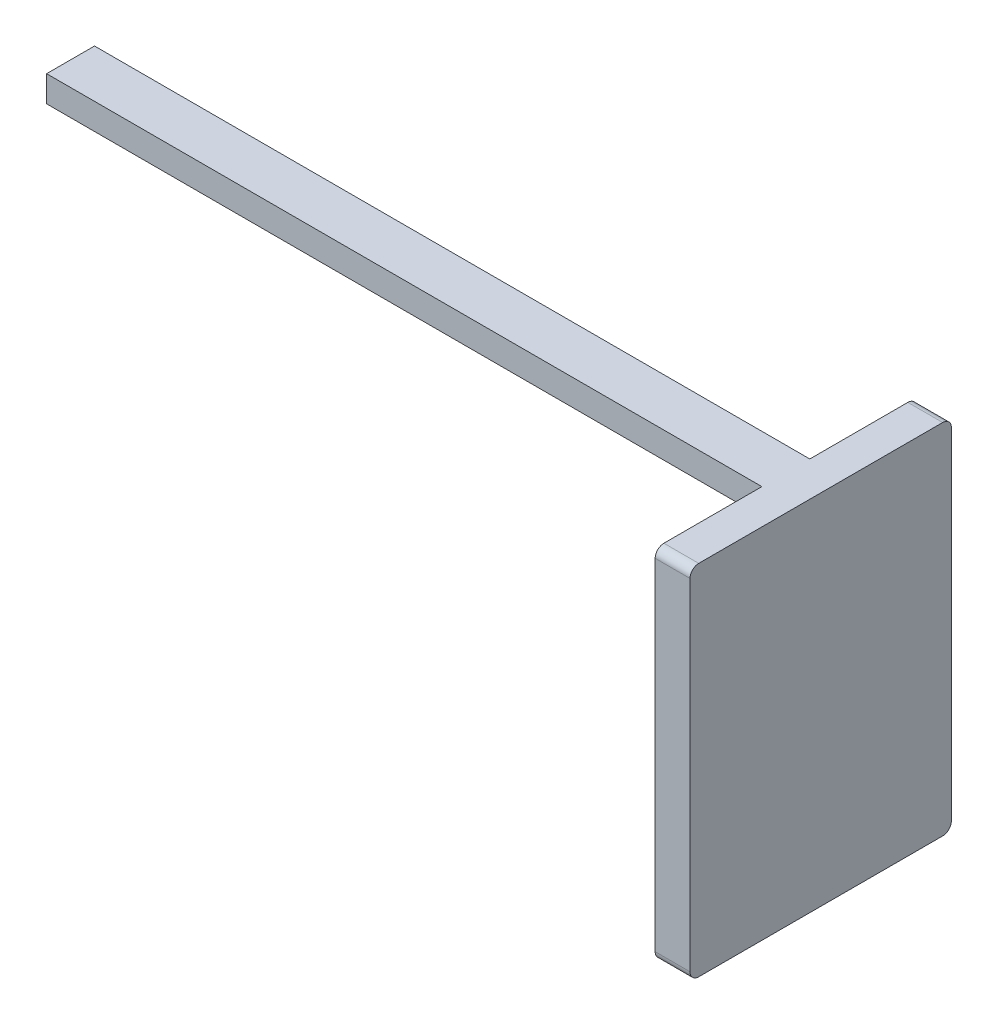
ISO-10303-21;
HEADER;
FILE_DESCRIPTION(('STEP AP214'),'2;1');
FILE_NAME('part.step','',(''),(''),'','','');
FILE_SCHEMA(('AUTOMOTIVE_DESIGN { 1 0 10303 214 1 1 1 1 }'));
ENDSEC;
DATA;
#1=APPLICATION_CONTEXT('core data for automotive mechanical design processes');
#2=APPLICATION_PROTOCOL_DEFINITION('international standard','automotive_design',2000,#1);
#3=PRODUCT_CONTEXT('',#1,'mechanical');
#4=PRODUCT('Part','Part','',(#3));
#5=PRODUCT_RELATED_PRODUCT_CATEGORY('part','',(#4));
#6=PRODUCT_DEFINITION_FORMATION('','',#4);
#7=PRODUCT_DEFINITION_CONTEXT('part definition',#1,'design');
#8=PRODUCT_DEFINITION('design','',#6,#7);
#9=PRODUCT_DEFINITION_SHAPE('','',#8);
#10=(LENGTH_UNIT() NAMED_UNIT(*) SI_UNIT(.MILLI.,.METRE.));
#11=(NAMED_UNIT(*) PLANE_ANGLE_UNIT() SI_UNIT($,.RADIAN.));
#12=(NAMED_UNIT(*) SI_UNIT($,.STERADIAN.) SOLID_ANGLE_UNIT());
#13=UNCERTAINTY_MEASURE_WITH_UNIT(LENGTH_MEASURE(1.E-05),#10,'distance_accuracy_value','');
#14=(GEOMETRIC_REPRESENTATION_CONTEXT(3) GLOBAL_UNCERTAINTY_ASSIGNED_CONTEXT((#13)) GLOBAL_UNIT_ASSIGNED_CONTEXT((#10,
#11,#12)) REPRESENTATION_CONTEXT('',''));
#15=CARTESIAN_POINT('',(0.,0.,0.));
#16=DIRECTION('',(0.,0.,1.));
#17=DIRECTION('',(1.,0.,0.));
#18=AXIS2_PLACEMENT_3D('',#15,#16,#17);
#19=CARTESIAN_POINT('',(-50.,0.,0.));
#20=DIRECTION('',(1.,0.,0.));
#21=DIRECTION('',(0.,0.,-1.));
#22=AXIS2_PLACEMENT_3D('',#19,#20,#21);
#23=PLANE('',#22);
#24=DIRECTION('',(0.,-1.,0.));
#25=VECTOR('',#24,1.);
#26=CARTESIAN_POINT('',(-50.,397.,-27.5));
#27=LINE('',#26,#25);
#28=CARTESIAN_POINT('',(-50.,397.,-27.5));
#29=VERTEX_POINT('',#28);
#30=CARTESIAN_POINT('',(-50.,367.,-27.5));
#31=VERTEX_POINT('',#30);
#32=EDGE_CURVE('E80',#29,#31,#27,.T.);
#33=ORIENTED_EDGE('',*,*,#32,.F.);
#34=DIRECTION('',(0.,0.,1.));
#35=VECTOR('',#34,1.);
#36=CARTESIAN_POINT('',(-50.,397.,-245.));
#37=LINE('',#36,#35);
#38=CARTESIAN_POINT('',(-50.,397.,-140.));
#39=VERTEX_POINT('',#38);
#40=EDGE_CURVE('E71',#39,#29,#37,.T.);
#41=ORIENTED_EDGE('',*,*,#40,.F.);
#42=CARTESIAN_POINT('',(-50.,387.,-140.));
#43=DIRECTION('',(1.,0.,0.));
#44=DIRECTION('',(0.,0.,-1.));
#45=AXIS2_PLACEMENT_3D('',#42,#43,#44);
#46=CIRCLE('',#45,10.);
#47=CARTESIAN_POINT('',(-50.,387.,-150.));
#48=VERTEX_POINT('',#47);
#49=EDGE_CURVE('E449',#39,#48,#46,.F.);
#50=ORIENTED_EDGE('',*,*,#49,.T.);
#51=DIRECTION('',(0.,1.,0.));
#52=VECTOR('',#51,1.);
#53=CARTESIAN_POINT('',(-50.,-397.,-150.));
#54=LINE('',#53,#52);
#55=CARTESIAN_POINT('',(-50.,-4.,-150.));
#56=VERTEX_POINT('',#55);
#57=EDGE_CURVE('E72',#56,#48,#54,.T.);
#58=ORIENTED_EDGE('',*,*,#57,.F.);
#59=CARTESIAN_POINT('',(-50.,-4.,-140.));
#60=DIRECTION('',(1.,0.,0.));
#61=DIRECTION('',(0.,0.,-1.));
#62=AXIS2_PLACEMENT_3D('',#59,#60,#61);
#63=CIRCLE('',#62,10.);
#64=CARTESIAN_POINT('',(-50.,-14.,-140.));
#65=VERTEX_POINT('',#64);
#66=EDGE_CURVE('E488',#56,#65,#63,.F.);
#67=ORIENTED_EDGE('',*,*,#66,.T.);
#68=DIRECTION('',(0.,0.,-1.));
#69=VECTOR('',#68,1.);
#70=CARTESIAN_POINT('',(-50.,-14.,245.));
#71=LINE('',#70,#69);
#72=CARTESIAN_POINT('',(-50.,-14.,140.));
#73=VERTEX_POINT('',#72);
#74=EDGE_CURVE('E444',#73,#65,#71,.T.);
#75=ORIENTED_EDGE('',*,*,#74,.F.);
#76=CARTESIAN_POINT('',(-50.,-4.,140.));
#77=DIRECTION('',(1.,0.,0.));
#78=DIRECTION('',(0.,0.,-1.));
#79=AXIS2_PLACEMENT_3D('',#76,#77,#78);
#80=CIRCLE('',#79,10.);
#81=CARTESIAN_POINT('',(-50.,-4.,150.));
#82=VERTEX_POINT('',#81);
#83=EDGE_CURVE('E422',#73,#82,#80,.F.);
#84=ORIENTED_EDGE('',*,*,#83,.T.);
#85=DIRECTION('',(0.,-1.,0.));
#86=VECTOR('',#85,1.);
#87=CARTESIAN_POINT('',(-50.,397.,150.));
#88=LINE('',#87,#86);
#89=CARTESIAN_POINT('',(-50.,387.,150.));
#90=VERTEX_POINT('',#89);
#91=EDGE_CURVE('E442',#90,#82,#88,.T.);
#92=ORIENTED_EDGE('',*,*,#91,.F.);
#93=CARTESIAN_POINT('',(-50.,387.,140.));
#94=DIRECTION('',(1.,0.,0.));
#95=DIRECTION('',(0.,0.,-1.));
#96=AXIS2_PLACEMENT_3D('',#93,#94,#95);
#97=CIRCLE('',#96,10.);
#98=CARTESIAN_POINT('',(-50.,397.,140.));
#99=VERTEX_POINT('',#98);
#100=EDGE_CURVE('E11',#90,#99,#97,.F.);
#101=ORIENTED_EDGE('',*,*,#100,.T.);
#102=CARTESIAN_POINT('',(-50.,397.,27.5));
#103=VERTEX_POINT('',#102);
#104=EDGE_CURVE('E61',#103,#99,#37,.T.);
#105=ORIENTED_EDGE('',*,*,#104,.F.);
#106=DIRECTION('',(0.,1.,0.));
#107=VECTOR('',#106,1.);
#108=CARTESIAN_POINT('',(-50.,307.,27.5));
#109=LINE('',#108,#107);
#110=CARTESIAN_POINT('',(-50.,367.,27.5));
#111=VERTEX_POINT('',#110);
#112=EDGE_CURVE('E63',#111,#103,#109,.T.);
#113=ORIENTED_EDGE('',*,*,#112,.F.);
#114=DIRECTION('',(0.,0.,1.));
#115=VECTOR('',#114,1.);
#116=CARTESIAN_POINT('',(-50.,367.,-30.));
#117=LINE('',#116,#115);
#118=EDGE_CURVE('E37',#31,#111,#117,.T.);
#119=ORIENTED_EDGE('',*,*,#118,.F.);
#120=EDGE_LOOP('',(#33,#41,#50,#58,#67,#75,#84,#92,#101,#105,#113,#119));
#121=FACE_BOUND('',#120,.T.);
#122=ADVANCED_FACE('F18',(#121),#23,.F.);
#123=CARTESIAN_POINT('',(-50.,-397.,-150.));
#124=DIRECTION('',(0.,0.,-1.));
#125=DIRECTION('',(-1.,0.,0.));
#126=AXIS2_PLACEMENT_3D('',#123,#124,#125);
#127=PLANE('',#126);
#128=ORIENTED_EDGE('',*,*,#57,.T.);
#129=DIRECTION('',(1.,0.,0.));
#130=VECTOR('',#129,1.);
#131=CARTESIAN_POINT('',(-50.,387.,-150.));
#132=LINE('',#131,#130);
#133=CARTESIAN_POINT('',(-10.,387.,-150.));
#134=VERTEX_POINT('',#133);
#135=EDGE_CURVE('E484',#48,#134,#132,.T.);
#136=ORIENTED_EDGE('',*,*,#135,.T.);
#137=DIRECTION('',(0.,1.,0.));
#138=VECTOR('',#137,1.);
#139=CARTESIAN_POINT('',(-10.,-397.,-150.));
#140=LINE('',#139,#138);
#141=CARTESIAN_POINT('',(-10.,-4.,-150.));
#142=VERTEX_POINT('',#141);
#143=EDGE_CURVE('E88',#142,#134,#140,.T.);
#144=ORIENTED_EDGE('',*,*,#143,.F.);
#145=DIRECTION('',(1.,0.,0.));
#146=VECTOR('',#145,1.);
#147=CARTESIAN_POINT('',(-50.,-4.,-150.));
#148=LINE('',#147,#146);
#149=EDGE_CURVE('E489',#142,#56,#148,.F.);
#150=ORIENTED_EDGE('',*,*,#149,.T.);
#151=EDGE_LOOP('',(#128,#136,#144,#150));
#152=FACE_BOUND('',#151,.T.);
#153=ADVANCED_FACE('F122',(#152),#127,.T.);
#154=CARTESIAN_POINT('',(-50.,397.,-245.));
#155=DIRECTION('',(0.,1.,0.));
#156=DIRECTION('',(0.,0.,1.));
#157=AXIS2_PLACEMENT_3D('',#154,#155,#156);
#158=PLANE('',#157);
#159=ORIENTED_EDGE('',*,*,#40,.T.);
#160=DIRECTION('',(1.,0.,0.));
#161=VECTOR('',#160,1.);
#162=CARTESIAN_POINT('',(-1850.,397.,-27.5));
#163=LINE('',#162,#161);
#164=CARTESIAN_POINT('',(-871.,397.,-27.5));
#165=VERTEX_POINT('',#164);
#166=EDGE_CURVE('E86',#165,#29,#163,.T.);
#167=ORIENTED_EDGE('',*,*,#166,.F.);
#168=DIRECTION('',(0.,0.,-1.));
#169=VECTOR('',#168,1.);
#170=CARTESIAN_POINT('',(-871.,397.,0.));
#171=LINE('',#170,#169);
#172=CARTESIAN_POINT('',(-871.,397.,27.5));
#173=VERTEX_POINT('',#172);
#174=EDGE_CURVE('E85',#173,#165,#171,.T.);
#175=ORIENTED_EDGE('',*,*,#174,.F.);
#176=DIRECTION('',(1.,0.,0.));
#177=VECTOR('',#176,1.);
#178=CARTESIAN_POINT('',(-1850.,397.,27.5));
#179=LINE('',#178,#177);
#180=EDGE_CURVE('E75',#173,#103,#179,.T.);
#181=ORIENTED_EDGE('',*,*,#180,.T.);
#182=ORIENTED_EDGE('',*,*,#104,.T.);
#183=DIRECTION('',(1.,0.,0.));
#184=VECTOR('',#183,1.);
#185=CARTESIAN_POINT('',(-50.,397.,140.));
#186=LINE('',#185,#184);
#187=CARTESIAN_POINT('',(-10.,397.,140.));
#188=VERTEX_POINT('',#187);
#189=EDGE_CURVE('E446',#99,#188,#186,.T.);
#190=ORIENTED_EDGE('',*,*,#189,.T.);
#191=DIRECTION('',(0.,0.,1.));
#192=VECTOR('',#191,1.);
#193=CARTESIAN_POINT('',(-10.,397.,-245.));
#194=LINE('',#193,#192);
#195=CARTESIAN_POINT('',(-10.,397.,-140.));
#196=VERTEX_POINT('',#195);
#197=EDGE_CURVE('E464',#196,#188,#194,.T.);
#198=ORIENTED_EDGE('',*,*,#197,.F.);
#199=DIRECTION('',(1.,0.,0.));
#200=VECTOR('',#199,1.);
#201=CARTESIAN_POINT('',(-50.,397.,-140.));
#202=LINE('',#201,#200);
#203=EDGE_CURVE('E497',#196,#39,#202,.F.);
#204=ORIENTED_EDGE('',*,*,#203,.T.);
#205=EDGE_LOOP('',(#159,#167,#175,#181,#182,#190,#198,#204));
#206=FACE_BOUND('',#205,.T.);
#207=ADVANCED_FACE('F83',(#206),#158,.T.);
#208=CARTESIAN_POINT('',(-50.,397.,150.));
#209=DIRECTION('',(0.,0.,1.));
#210=DIRECTION('',(1.,0.,0.));
#211=AXIS2_PLACEMENT_3D('',#208,#209,#210);
#212=PLANE('',#211);
#213=DIRECTION('',(0.,-1.,0.));
#214=VECTOR('',#213,1.);
#215=CARTESIAN_POINT('',(-10.,397.,150.));
#216=LINE('',#215,#214);
#217=CARTESIAN_POINT('',(-10.,387.,150.));
#218=VERTEX_POINT('',#217);
#219=CARTESIAN_POINT('',(-10.,-4.,150.));
#220=VERTEX_POINT('',#219);
#221=EDGE_CURVE('E459',#218,#220,#216,.T.);
#222=ORIENTED_EDGE('',*,*,#221,.F.);
#223=DIRECTION('',(1.,0.,0.));
#224=VECTOR('',#223,1.);
#225=CARTESIAN_POINT('',(-50.,387.,150.));
#226=LINE('',#225,#224);
#227=EDGE_CURVE('E28',#218,#90,#226,.F.);
#228=ORIENTED_EDGE('',*,*,#227,.T.);
#229=ORIENTED_EDGE('',*,*,#91,.T.);
#230=DIRECTION('',(1.,0.,0.));
#231=VECTOR('',#230,1.);
#232=CARTESIAN_POINT('',(-50.,-4.,150.));
#233=LINE('',#232,#231);
#234=EDGE_CURVE('E429',#82,#220,#233,.T.);
#235=ORIENTED_EDGE('',*,*,#234,.T.);
#236=EDGE_LOOP('',(#222,#228,#229,#235));
#237=FACE_BOUND('',#236,.T.);
#238=ADVANCED_FACE('F132',(#237),#212,.T.);
#239=CARTESIAN_POINT('',(-50.,-14.,245.));
#240=DIRECTION('',(0.,-1.,0.));
#241=DIRECTION('',(0.,0.,-1.));
#242=AXIS2_PLACEMENT_3D('',#239,#240,#241);
#243=PLANE('',#242);
#244=ORIENTED_EDGE('',*,*,#74,.T.);
#245=DIRECTION('',(1.,0.,0.));
#246=VECTOR('',#245,1.);
#247=CARTESIAN_POINT('',(-50.,-14.,-140.));
#248=LINE('',#247,#246);
#249=CARTESIAN_POINT('',(-10.,-14.,-140.));
#250=VERTEX_POINT('',#249);
#251=EDGE_CURVE('E433',#65,#250,#248,.T.);
#252=ORIENTED_EDGE('',*,*,#251,.T.);
#253=DIRECTION('',(0.,0.,-1.));
#254=VECTOR('',#253,1.);
#255=CARTESIAN_POINT('',(-10.,-14.,245.));
#256=LINE('',#255,#254);
#257=CARTESIAN_POINT('',(-10.,-14.,140.));
#258=VERTEX_POINT('',#257);
#259=EDGE_CURVE('E463',#258,#250,#256,.T.);
#260=ORIENTED_EDGE('',*,*,#259,.F.);
#261=DIRECTION('',(1.,0.,0.));
#262=VECTOR('',#261,1.);
#263=CARTESIAN_POINT('',(-50.,-14.,140.));
#264=LINE('',#263,#262);
#265=EDGE_CURVE('E426',#258,#73,#264,.F.);
#266=ORIENTED_EDGE('',*,*,#265,.T.);
#267=EDGE_LOOP('',(#244,#252,#260,#266));
#268=FACE_BOUND('',#267,.T.);
#269=ADVANCED_FACE('F137',(#268),#243,.T.);
#270=CARTESIAN_POINT('',(-10.,0.,0.));
#271=DIRECTION('',(1.,0.,0.));
#272=DIRECTION('',(0.,0.,-1.));
#273=AXIS2_PLACEMENT_3D('',#270,#271,#272);
#274=PLANE('',#273);
#275=ORIENTED_EDGE('',*,*,#197,.T.);
#276=CARTESIAN_POINT('',(-10.,387.,140.));
#277=DIRECTION('',(1.,0.,0.));
#278=DIRECTION('',(0.,0.,-1.));
#279=AXIS2_PLACEMENT_3D('',#276,#277,#278);
#280=CIRCLE('',#279,10.);
#281=EDGE_CURVE('E448',#188,#218,#280,.T.);
#282=ORIENTED_EDGE('',*,*,#281,.T.);
#283=ORIENTED_EDGE('',*,*,#221,.T.);
#284=CARTESIAN_POINT('',(-10.,-4.,140.));
#285=DIRECTION('',(1.,0.,0.));
#286=DIRECTION('',(0.,0.,-1.));
#287=AXIS2_PLACEMENT_3D('',#284,#285,#286);
#288=CIRCLE('',#287,10.);
#289=EDGE_CURVE('E438',#220,#258,#288,.T.);
#290=ORIENTED_EDGE('',*,*,#289,.T.);
#291=ORIENTED_EDGE('',*,*,#259,.T.);
#292=CARTESIAN_POINT('',(-10.,-4.,-140.));
#293=DIRECTION('',(1.,0.,0.));
#294=DIRECTION('',(0.,0.,-1.));
#295=AXIS2_PLACEMENT_3D('',#292,#293,#294);
#296=CIRCLE('',#295,10.);
#297=EDGE_CURVE('E436',#250,#142,#296,.T.);
#298=ORIENTED_EDGE('',*,*,#297,.T.);
#299=ORIENTED_EDGE('',*,*,#143,.T.);
#300=CARTESIAN_POINT('',(-10.,387.,-140.));
#301=DIRECTION('',(1.,0.,0.));
#302=DIRECTION('',(0.,0.,-1.));
#303=AXIS2_PLACEMENT_3D('',#300,#301,#302);
#304=CIRCLE('',#303,10.);
#305=EDGE_CURVE('E487',#134,#196,#304,.T.);
#306=ORIENTED_EDGE('',*,*,#305,.T.);
#307=EDGE_LOOP('',(#275,#282,#283,#290,#291,#298,#299,#306));
#308=FACE_BOUND('',#307,.T.);
#309=ADVANCED_FACE('F133',(#308),#274,.T.);
#310=CARTESIAN_POINT('',(-50.,-4.,140.));
#311=DIRECTION('',(1.,0.,0.));
#312=DIRECTION('',(0.,0.,-1.));
#313=AXIS2_PLACEMENT_3D('',#310,#311,#312);
#314=CYLINDRICAL_SURFACE('',#313,10.);
#315=ORIENTED_EDGE('',*,*,#83,.F.);
#316=ORIENTED_EDGE('',*,*,#265,.F.);
#317=ORIENTED_EDGE('',*,*,#289,.F.);
#318=ORIENTED_EDGE('',*,*,#234,.F.);
#319=EDGE_LOOP('',(#315,#316,#317,#318));
#320=FACE_BOUND('',#319,.T.);
#321=ADVANCED_FACE('F136',(#320),#314,.T.);
#322=CARTESIAN_POINT('',(-50.,-4.,-140.));
#323=DIRECTION('',(1.,0.,0.));
#324=DIRECTION('',(0.,0.,-1.));
#325=AXIS2_PLACEMENT_3D('',#322,#323,#324);
#326=CYLINDRICAL_SURFACE('',#325,10.);
#327=ORIENTED_EDGE('',*,*,#66,.F.);
#328=ORIENTED_EDGE('',*,*,#149,.F.);
#329=ORIENTED_EDGE('',*,*,#297,.F.);
#330=ORIENTED_EDGE('',*,*,#251,.F.);
#331=EDGE_LOOP('',(#327,#328,#329,#330));
#332=FACE_BOUND('',#331,.T.);
#333=ADVANCED_FACE('F142',(#332),#326,.T.);
#334=CARTESIAN_POINT('',(-50.,387.,-140.));
#335=DIRECTION('',(1.,0.,0.));
#336=DIRECTION('',(0.,0.,-1.));
#337=AXIS2_PLACEMENT_3D('',#334,#335,#336);
#338=CYLINDRICAL_SURFACE('',#337,10.);
#339=ORIENTED_EDGE('',*,*,#49,.F.);
#340=ORIENTED_EDGE('',*,*,#203,.F.);
#341=ORIENTED_EDGE('',*,*,#305,.F.);
#342=ORIENTED_EDGE('',*,*,#135,.F.);
#343=EDGE_LOOP('',(#339,#340,#341,#342));
#344=FACE_BOUND('',#343,.T.);
#345=ADVANCED_FACE('F118',(#344),#338,.T.);
#346=CARTESIAN_POINT('',(-50.,387.,140.));
#347=DIRECTION('',(1.,0.,0.));
#348=DIRECTION('',(0.,0.,-1.));
#349=AXIS2_PLACEMENT_3D('',#346,#347,#348);
#350=CYLINDRICAL_SURFACE('',#349,10.);
#351=ORIENTED_EDGE('',*,*,#100,.F.);
#352=ORIENTED_EDGE('',*,*,#227,.F.);
#353=ORIENTED_EDGE('',*,*,#281,.F.);
#354=ORIENTED_EDGE('',*,*,#189,.F.);
#355=EDGE_LOOP('',(#351,#352,#353,#354));
#356=FACE_BOUND('',#355,.T.);
#357=ADVANCED_FACE('F111',(#356),#350,.T.);
#358=CARTESIAN_POINT('',(-1850.,367.,-30.));
#359=DIRECTION('',(0.,1.,0.));
#360=DIRECTION('',(0.,0.,1.));
#361=AXIS2_PLACEMENT_3D('',#358,#359,#360);
#362=PLANE('',#361);
#363=ORIENTED_EDGE('',*,*,#118,.T.);
#364=DIRECTION('',(1.,0.,0.));
#365=VECTOR('',#364,1.);
#366=CARTESIAN_POINT('',(-1850.,367.,27.5));
#367=LINE('',#366,#365);
#368=CARTESIAN_POINT('',(-871.,367.,27.5));
#369=VERTEX_POINT('',#368);
#370=EDGE_CURVE('E78',#369,#111,#367,.T.);
#371=ORIENTED_EDGE('',*,*,#370,.F.);
#372=DIRECTION('',(0.,0.,1.));
#373=VECTOR('',#372,1.);
#374=CARTESIAN_POINT('',(-871.,367.,-30.));
#375=LINE('',#374,#373);
#376=CARTESIAN_POINT('',(-871.,367.,-27.5));
#377=VERTEX_POINT('',#376);
#378=EDGE_CURVE('E99',#377,#369,#375,.T.);
#379=ORIENTED_EDGE('',*,*,#378,.F.);
#380=DIRECTION('',(1.,0.,0.));
#381=VECTOR('',#380,1.);
#382=CARTESIAN_POINT('',(-1850.,367.,-27.5));
#383=LINE('',#382,#381);
#384=EDGE_CURVE('E91',#377,#31,#383,.T.);
#385=ORIENTED_EDGE('',*,*,#384,.T.);
#386=EDGE_LOOP('',(#363,#371,#379,#385));
#387=FACE_BOUND('',#386,.T.);
#388=ADVANCED_FACE('F109',(#387),#362,.F.);
#389=CARTESIAN_POINT('',(-1850.,307.,27.5));
#390=DIRECTION('',(0.,0.,-1.));
#391=DIRECTION('',(-1.,0.,0.));
#392=AXIS2_PLACEMENT_3D('',#389,#390,#391);
#393=PLANE('',#392);
#394=ORIENTED_EDGE('',*,*,#112,.T.);
#395=ORIENTED_EDGE('',*,*,#180,.F.);
#396=DIRECTION('',(0.,1.,0.));
#397=VECTOR('',#396,1.);
#398=CARTESIAN_POINT('',(-871.,307.,27.5));
#399=LINE('',#398,#397);
#400=EDGE_CURVE('E22',#369,#173,#399,.T.);
#401=ORIENTED_EDGE('',*,*,#400,.F.);
#402=ORIENTED_EDGE('',*,*,#370,.T.);
#403=EDGE_LOOP('',(#394,#395,#401,#402));
#404=FACE_BOUND('',#403,.T.);
#405=ADVANCED_FACE('F74',(#404),#393,.F.);
#406=CARTESIAN_POINT('',(-1850.,397.,-27.5));
#407=DIRECTION('',(0.,0.,1.));
#408=DIRECTION('',(1.,0.,0.));
#409=AXIS2_PLACEMENT_3D('',#406,#407,#408);
#410=PLANE('',#409);
#411=ORIENTED_EDGE('',*,*,#32,.T.);
#412=ORIENTED_EDGE('',*,*,#384,.F.);
#413=DIRECTION('',(0.,-1.,0.));
#414=VECTOR('',#413,1.);
#415=CARTESIAN_POINT('',(-871.,397.,-27.5));
#416=LINE('',#415,#414);
#417=EDGE_CURVE('E97',#165,#377,#416,.T.);
#418=ORIENTED_EDGE('',*,*,#417,.F.);
#419=ORIENTED_EDGE('',*,*,#166,.T.);
#420=EDGE_LOOP('',(#411,#412,#418,#419));
#421=FACE_BOUND('',#420,.T.);
#422=ADVANCED_FACE('F106',(#421),#410,.F.);
#423=CARTESIAN_POINT('',(-871.,0.,0.));
#424=DIRECTION('',(-1.,0.,0.));
#425=DIRECTION('',(0.,0.,1.));
#426=AXIS2_PLACEMENT_3D('',#423,#424,#425);
#427=PLANE('',#426);
#428=ORIENTED_EDGE('',*,*,#378,.T.);
#429=ORIENTED_EDGE('',*,*,#400,.T.);
#430=ORIENTED_EDGE('',*,*,#174,.T.);
#431=ORIENTED_EDGE('',*,*,#417,.T.);
#432=EDGE_LOOP('',(#428,#429,#430,#431));
#433=FACE_BOUND('',#432,.T.);
#434=ADVANCED_FACE('F20',(#433),#427,.T.);
#435=CLOSED_SHELL('',(#122,#153,#207,#238,#269,#309,#321,#333,#345,#357,#388,#405,#422,#434));
#436=MANIFOLD_SOLID_BREP('B1',#435);
#437=ADVANCED_BREP_SHAPE_REPRESENTATION('',(#18,#436),#14);
#438=SHAPE_DEFINITION_REPRESENTATION(#9,#437);
ENDSEC;
END-ISO-10303-21;
